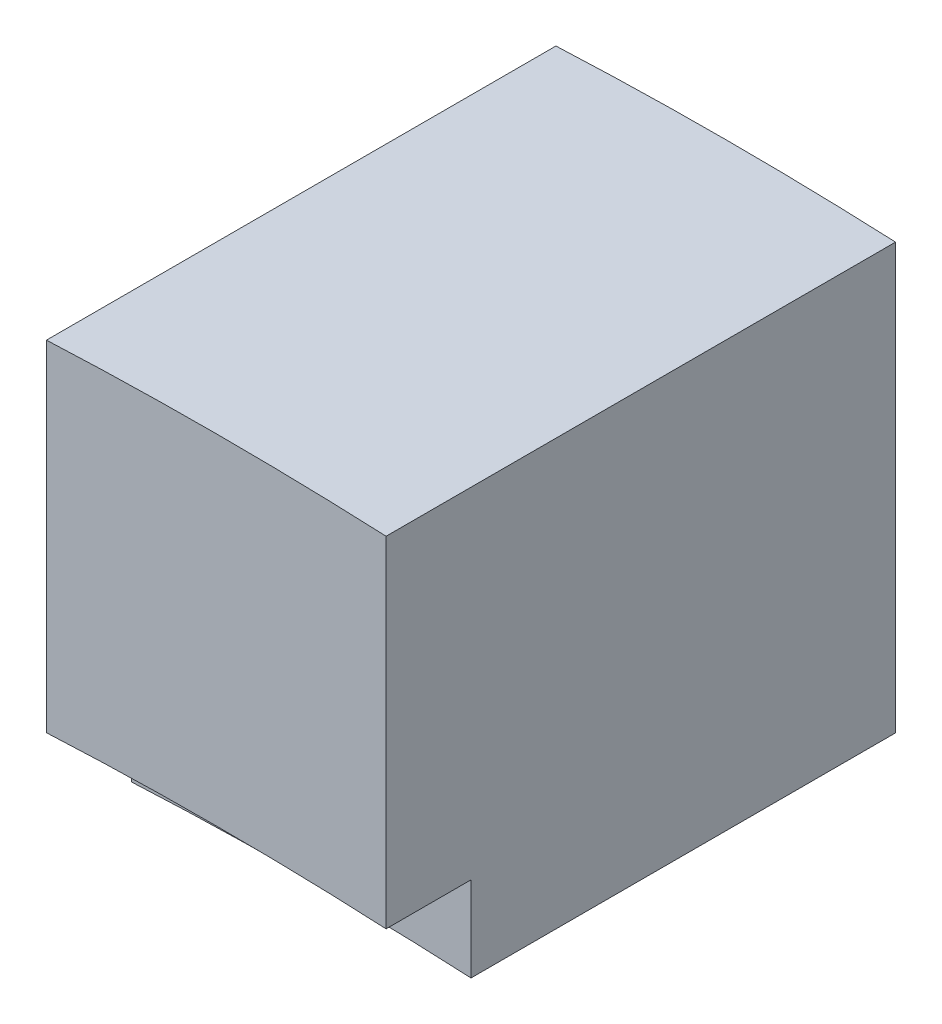
ISO-10303-21;
HEADER;
FILE_DESCRIPTION(('STEP AP214'),'2;1');
FILE_NAME('part.step','',(''),(''),'','','');
FILE_SCHEMA(('AUTOMOTIVE_DESIGN { 1 0 10303 214 1 1 1 1 }'));
ENDSEC;
DATA;
#1=APPLICATION_CONTEXT('core data for automotive mechanical design processes');
#2=APPLICATION_PROTOCOL_DEFINITION('international standard','automotive_design',2000,#1);
#3=PRODUCT_CONTEXT('',#1,'mechanical');
#4=PRODUCT('Part','Part','',(#3));
#5=PRODUCT_RELATED_PRODUCT_CATEGORY('part','',(#4));
#6=PRODUCT_DEFINITION_FORMATION('','',#4);
#7=PRODUCT_DEFINITION_CONTEXT('part definition',#1,'design');
#8=PRODUCT_DEFINITION('design','',#6,#7);
#9=PRODUCT_DEFINITION_SHAPE('','',#8);
#10=(LENGTH_UNIT() NAMED_UNIT(*) SI_UNIT(.MILLI.,.METRE.));
#11=(NAMED_UNIT(*) PLANE_ANGLE_UNIT() SI_UNIT($,.RADIAN.));
#12=(NAMED_UNIT(*) SI_UNIT($,.STERADIAN.) SOLID_ANGLE_UNIT());
#13=UNCERTAINTY_MEASURE_WITH_UNIT(LENGTH_MEASURE(1.E-05),#10,'distance_accuracy_value','');
#14=(GEOMETRIC_REPRESENTATION_CONTEXT(3) GLOBAL_UNCERTAINTY_ASSIGNED_CONTEXT((#13)) GLOBAL_UNIT_ASSIGNED_CONTEXT((#10,
#11,#12)) REPRESENTATION_CONTEXT('',''));
#15=CARTESIAN_POINT('',(0.,0.,0.));
#16=DIRECTION('',(0.,0.,1.));
#17=DIRECTION('',(1.,0.,0.));
#18=AXIS2_PLACEMENT_3D('',#15,#16,#17);
#19=CARTESIAN_POINT('',(0.,0.,25.));
#20=DIRECTION('',(0.,0.,-1.));
#21=DIRECTION('',(-1.,0.,0.));
#22=AXIS2_PLACEMENT_3D('',#19,#20,#21);
#23=PLANE('',#22);
#24=CARTESIAN_POINT('',(0.,0.,25.));
#25=DIRECTION('',(0.,0.,-1.));
#26=DIRECTION('',(-1.,0.,0.));
#27=AXIS2_PLACEMENT_3D('',#24,#25,#26);
#28=CIRCLE('',#27,200.);
#29=CARTESIAN_POINT('',(-10.,199.749843554382,25.));
#30=VERTEX_POINT('',#29);
#31=CARTESIAN_POINT('',(10.,199.749843554382,25.));
#32=VERTEX_POINT('',#31);
#33=EDGE_CURVE('E94',#30,#32,#28,.T.);
#34=ORIENTED_EDGE('',*,*,#33,.F.);
#35=DIRECTION('',(0.,-1.,0.));
#36=VECTOR('',#35,1.);
#37=CARTESIAN_POINT('',(-10.,219.772609758359,25.));
#38=LINE('',#37,#36);
#39=CARTESIAN_POINT('',(-10.,194.743420941504,25.));
#40=VERTEX_POINT('',#39);
#41=EDGE_CURVE('E46',#30,#40,#38,.T.);
#42=ORIENTED_EDGE('',*,*,#41,.T.);
#43=CARTESIAN_POINT('',(0.,0.,25.));
#44=DIRECTION('',(0.,0.,-1.));
#45=DIRECTION('',(1.,0.,0.));
#46=AXIS2_PLACEMENT_3D('',#43,#44,#45);
#47=CIRCLE('',#46,195.);
#48=CARTESIAN_POINT('',(10.,194.743420941504,25.));
#49=VERTEX_POINT('',#48);
#50=EDGE_CURVE('E82',#40,#49,#47,.T.);
#51=ORIENTED_EDGE('',*,*,#50,.T.);
#52=DIRECTION('',(0.,1.,0.));
#53=VECTOR('',#52,1.);
#54=CARTESIAN_POINT('',(10.,194.743420941504,25.));
#55=LINE('',#54,#53);
#56=EDGE_CURVE('E38',#49,#32,#55,.T.);
#57=ORIENTED_EDGE('',*,*,#56,.T.);
#58=EDGE_LOOP('',(#34,#42,#51,#57));
#59=FACE_BOUND('',#58,.T.);
#60=ADVANCED_FACE('F17',(#59),#23,.F.);
#61=CARTESIAN_POINT('',(0.,0.,25.));
#62=DIRECTION('',(0.,0.,-1.));
#63=DIRECTION('',(-1.,0.,0.));
#64=AXIS2_PLACEMENT_3D('',#61,#62,#63);
#65=CYLINDRICAL_SURFACE('',#64,195.);
#66=CARTESIAN_POINT('',(0.,0.,0.));
#67=DIRECTION('',(0.,0.,-1.));
#68=DIRECTION('',(1.,0.,0.));
#69=AXIS2_PLACEMENT_3D('',#66,#67,#68);
#70=CIRCLE('',#69,195.);
#71=CARTESIAN_POINT('',(-10.,194.743420941504,0.));
#72=VERTEX_POINT('',#71);
#73=CARTESIAN_POINT('',(10.,194.743420941504,0.));
#74=VERTEX_POINT('',#73);
#75=EDGE_CURVE('E88',#72,#74,#70,.T.);
#76=ORIENTED_EDGE('',*,*,#75,.T.);
#77=DIRECTION('',(0.,0.,-1.));
#78=VECTOR('',#77,1.);
#79=CARTESIAN_POINT('',(10.,194.743420941504,25.));
#80=LINE('',#79,#78);
#81=EDGE_CURVE('E11',#49,#74,#80,.T.);
#82=ORIENTED_EDGE('',*,*,#81,.F.);
#83=ORIENTED_EDGE('',*,*,#50,.F.);
#84=DIRECTION('',(0.,0.,-1.));
#85=VECTOR('',#84,1.);
#86=CARTESIAN_POINT('',(-10.,194.743420941504,25.));
#87=LINE('',#86,#85);
#88=EDGE_CURVE('E73',#40,#72,#87,.T.);
#89=ORIENTED_EDGE('',*,*,#88,.T.);
#90=EDGE_LOOP('',(#76,#82,#83,#89));
#91=FACE_BOUND('',#90,.T.);
#92=ADVANCED_FACE('F19',(#91),#65,.F.);
#93=CARTESIAN_POINT('',(10.,194.743420941504,25.));
#94=DIRECTION('',(-1.,0.,0.));
#95=DIRECTION('',(0.,-1.,0.));
#96=AXIS2_PLACEMENT_3D('',#93,#94,#95);
#97=PLANE('',#96);
#98=DIRECTION('',(0.,0.,-1.));
#99=VECTOR('',#98,1.);
#100=CARTESIAN_POINT('',(10.,219.772609758359,25.));
#101=LINE('',#100,#99);
#102=CARTESIAN_POINT('',(10.,219.772609758359,30.));
#103=VERTEX_POINT('',#102);
#104=CARTESIAN_POINT('',(10.,219.772609758359,0.));
#105=VERTEX_POINT('',#104);
#106=EDGE_CURVE('E26',#103,#105,#101,.T.);
#107=ORIENTED_EDGE('',*,*,#106,.F.);
#108=DIRECTION('',(0.,1.,0.));
#109=VECTOR('',#108,1.);
#110=CARTESIAN_POINT('',(10.,199.749843554382,30.));
#111=LINE('',#110,#109);
#112=CARTESIAN_POINT('',(10.,199.749843554382,30.));
#113=VERTEX_POINT('',#112);
#114=EDGE_CURVE('E138',#113,#103,#111,.T.);
#115=ORIENTED_EDGE('',*,*,#114,.F.);
#116=DIRECTION('',(0.,0.,-1.));
#117=VECTOR('',#116,1.);
#118=CARTESIAN_POINT('',(10.,199.749843554382,30.));
#119=LINE('',#118,#117);
#120=EDGE_CURVE('E100',#113,#32,#119,.T.);
#121=ORIENTED_EDGE('',*,*,#120,.T.);
#122=ORIENTED_EDGE('',*,*,#56,.F.);
#123=ORIENTED_EDGE('',*,*,#81,.T.);
#124=DIRECTION('',(0.,1.,0.));
#125=VECTOR('',#124,1.);
#126=CARTESIAN_POINT('',(10.,194.743420941504,0.));
#127=LINE('',#126,#125);
#128=EDGE_CURVE('E92',#74,#105,#127,.T.);
#129=ORIENTED_EDGE('',*,*,#128,.T.);
#130=EDGE_LOOP('',(#107,#115,#121,#122,#123,#129));
#131=FACE_BOUND('',#130,.T.);
#132=ADVANCED_FACE('F154',(#131),#97,.F.);
#133=CARTESIAN_POINT('',(0.,0.,25.));
#134=DIRECTION('',(0.,0.,-1.));
#135=DIRECTION('',(-1.,0.,0.));
#136=AXIS2_PLACEMENT_3D('',#133,#134,#135);
#137=CYLINDRICAL_SURFACE('',#136,220.);
#138=CARTESIAN_POINT('',(0.,0.,0.));
#139=DIRECTION('',(0.,0.,1.));
#140=DIRECTION('',(1.,0.,0.));
#141=AXIS2_PLACEMENT_3D('',#138,#139,#140);
#142=CIRCLE('',#141,220.);
#143=CARTESIAN_POINT('',(-10.,219.772609758359,0.));
#144=VERTEX_POINT('',#143);
#145=EDGE_CURVE('E83',#105,#144,#142,.T.);
#146=ORIENTED_EDGE('',*,*,#145,.T.);
#147=DIRECTION('',(0.,0.,-1.));
#148=VECTOR('',#147,1.);
#149=CARTESIAN_POINT('',(-10.,219.772609758359,25.));
#150=LINE('',#149,#148);
#151=CARTESIAN_POINT('',(-10.,219.772609758359,30.));
#152=VERTEX_POINT('',#151);
#153=EDGE_CURVE('E77',#152,#144,#150,.T.);
#154=ORIENTED_EDGE('',*,*,#153,.F.);
#155=CARTESIAN_POINT('',(0.,0.,30.));
#156=DIRECTION('',(0.,0.,1.));
#157=DIRECTION('',(1.,0.,0.));
#158=AXIS2_PLACEMENT_3D('',#155,#156,#157);
#159=CIRCLE('',#158,220.);
#160=EDGE_CURVE('E114',#103,#152,#159,.T.);
#161=ORIENTED_EDGE('',*,*,#160,.F.);
#162=ORIENTED_EDGE('',*,*,#106,.T.);
#163=EDGE_LOOP('',(#146,#154,#161,#162));
#164=FACE_BOUND('',#163,.T.);
#165=ADVANCED_FACE('F111',(#164),#137,.T.);
#166=CARTESIAN_POINT('',(-10.,219.772609758359,25.));
#167=DIRECTION('',(1.,0.,0.));
#168=DIRECTION('',(0.,1.,0.));
#169=AXIS2_PLACEMENT_3D('',#166,#167,#168);
#170=PLANE('',#169);
#171=DIRECTION('',(0.,-1.,0.));
#172=VECTOR('',#171,1.);
#173=CARTESIAN_POINT('',(-10.,219.772609758359,0.));
#174=LINE('',#173,#172);
#175=EDGE_CURVE('E70',#144,#72,#174,.T.);
#176=ORIENTED_EDGE('',*,*,#175,.T.);
#177=ORIENTED_EDGE('',*,*,#88,.F.);
#178=ORIENTED_EDGE('',*,*,#41,.F.);
#179=DIRECTION('',(0.,0.,-1.));
#180=VECTOR('',#179,1.);
#181=CARTESIAN_POINT('',(-10.,199.749843554382,30.));
#182=LINE('',#181,#180);
#183=CARTESIAN_POINT('',(-10.,199.749843554382,30.));
#184=VERTEX_POINT('',#183);
#185=EDGE_CURVE('E130',#184,#30,#182,.T.);
#186=ORIENTED_EDGE('',*,*,#185,.F.);
#187=DIRECTION('',(0.,-1.,0.));
#188=VECTOR('',#187,1.);
#189=CARTESIAN_POINT('',(-10.,219.772609758359,30.));
#190=LINE('',#189,#188);
#191=EDGE_CURVE('E134',#152,#184,#190,.T.);
#192=ORIENTED_EDGE('',*,*,#191,.F.);
#193=ORIENTED_EDGE('',*,*,#153,.T.);
#194=EDGE_LOOP('',(#176,#177,#178,#186,#192,#193));
#195=FACE_BOUND('',#194,.T.);
#196=ADVANCED_FACE('F72',(#195),#170,.F.);
#197=CARTESIAN_POINT('',(0.,0.,0.));
#198=DIRECTION('',(0.,0.,-1.));
#199=DIRECTION('',(-1.,0.,0.));
#200=AXIS2_PLACEMENT_3D('',#197,#198,#199);
#201=PLANE('',#200);
#202=ORIENTED_EDGE('',*,*,#145,.F.);
#203=ORIENTED_EDGE('',*,*,#128,.F.);
#204=ORIENTED_EDGE('',*,*,#75,.F.);
#205=ORIENTED_EDGE('',*,*,#175,.F.);
#206=EDGE_LOOP('',(#202,#203,#204,#205));
#207=FACE_BOUND('',#206,.T.);
#208=ADVANCED_FACE('F91',(#207),#201,.T.);
#209=CARTESIAN_POINT('',(0.,0.,30.));
#210=DIRECTION('',(0.,0.,-1.));
#211=DIRECTION('',(-1.,0.,0.));
#212=AXIS2_PLACEMENT_3D('',#209,#210,#211);
#213=CYLINDRICAL_SURFACE('',#212,200.);
#214=ORIENTED_EDGE('',*,*,#185,.T.);
#215=ORIENTED_EDGE('',*,*,#33,.T.);
#216=ORIENTED_EDGE('',*,*,#120,.F.);
#217=CARTESIAN_POINT('',(0.,0.,30.));
#218=DIRECTION('',(0.,0.,-1.));
#219=DIRECTION('',(1.,0.,0.));
#220=AXIS2_PLACEMENT_3D('',#217,#218,#219);
#221=CIRCLE('',#220,200.);
#222=EDGE_CURVE('E135',#184,#113,#221,.T.);
#223=ORIENTED_EDGE('',*,*,#222,.F.);
#224=EDGE_LOOP('',(#214,#215,#216,#223));
#225=FACE_BOUND('',#224,.T.);
#226=ADVANCED_FACE('F167',(#225),#213,.F.);
#227=CARTESIAN_POINT('',(0.,0.,30.));
#228=DIRECTION('',(0.,0.,-1.));
#229=DIRECTION('',(-1.,0.,0.));
#230=AXIS2_PLACEMENT_3D('',#227,#228,#229);
#231=PLANE('',#230);
#232=ORIENTED_EDGE('',*,*,#222,.T.);
#233=ORIENTED_EDGE('',*,*,#114,.T.);
#234=ORIENTED_EDGE('',*,*,#160,.T.);
#235=ORIENTED_EDGE('',*,*,#191,.T.);
#236=EDGE_LOOP('',(#232,#233,#234,#235));
#237=FACE_BOUND('',#236,.T.);
#238=ADVANCED_FACE('F147',(#237),#231,.F.);
#239=CLOSED_SHELL('',(#60,#92,#132,#165,#196,#208,#226,#238));
#240=MANIFOLD_SOLID_BREP('B1',#239);
#241=ADVANCED_BREP_SHAPE_REPRESENTATION('',(#18,#240),#14);
#242=SHAPE_DEFINITION_REPRESENTATION(#9,#241);
ENDSEC;
END-ISO-10303-21;
